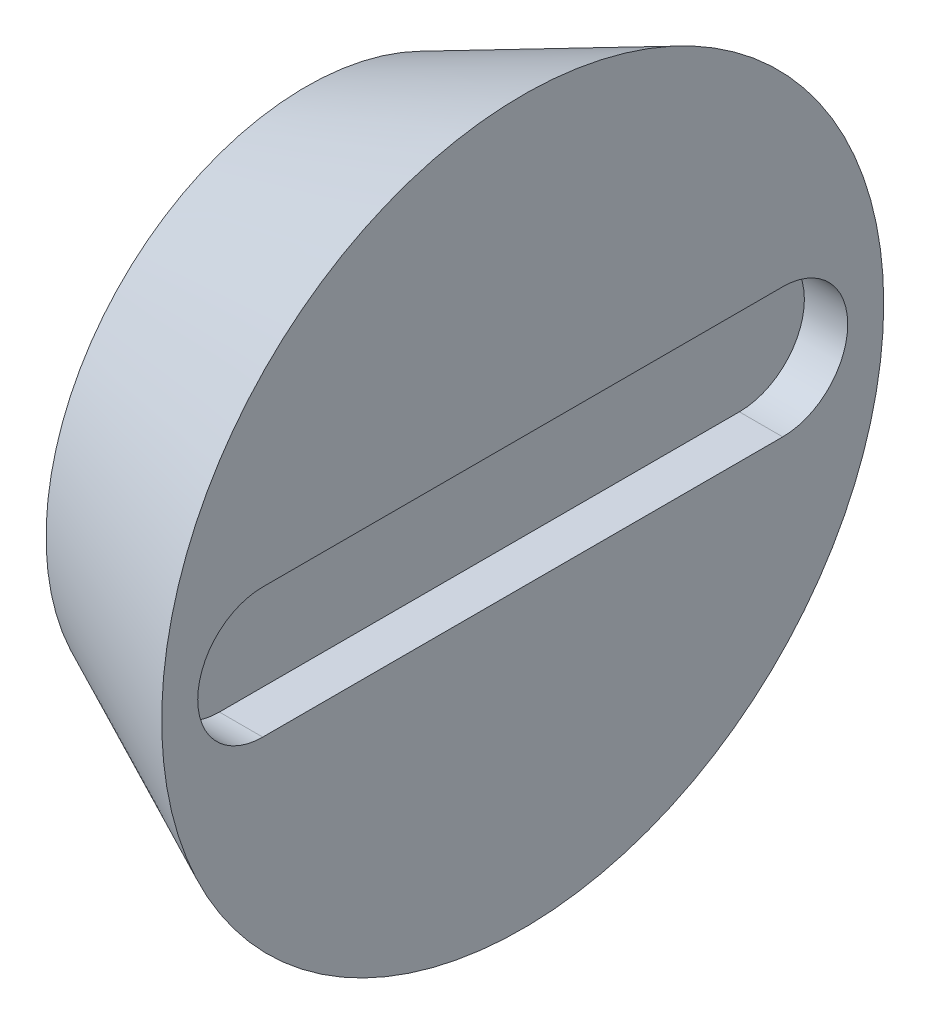
ISO-10303-21;
HEADER;
FILE_DESCRIPTION(('STEP AP214'),'2;1');
FILE_NAME('part.step','',(''),(''),'','','');
FILE_SCHEMA(('AUTOMOTIVE_DESIGN { 1 0 10303 214 1 1 1 1 }'));
ENDSEC;
DATA;
#1=APPLICATION_CONTEXT('core data for automotive mechanical design processes');
#2=APPLICATION_PROTOCOL_DEFINITION('international standard','automotive_design',2000,#1);
#3=PRODUCT_CONTEXT('',#1,'mechanical');
#4=PRODUCT('Part','Part','',(#3));
#5=PRODUCT_RELATED_PRODUCT_CATEGORY('part','',(#4));
#6=PRODUCT_DEFINITION_FORMATION('','',#4);
#7=PRODUCT_DEFINITION_CONTEXT('part definition',#1,'design');
#8=PRODUCT_DEFINITION('design','',#6,#7);
#9=PRODUCT_DEFINITION_SHAPE('','',#8);
#10=(LENGTH_UNIT() NAMED_UNIT(*) SI_UNIT(.MILLI.,.METRE.));
#11=(NAMED_UNIT(*) PLANE_ANGLE_UNIT() SI_UNIT($,.RADIAN.));
#12=(NAMED_UNIT(*) SI_UNIT($,.STERADIAN.) SOLID_ANGLE_UNIT());
#13=UNCERTAINTY_MEASURE_WITH_UNIT(LENGTH_MEASURE(1.E-05),#10,'distance_accuracy_value','');
#14=(GEOMETRIC_REPRESENTATION_CONTEXT(3) GLOBAL_UNCERTAINTY_ASSIGNED_CONTEXT((#13)) GLOBAL_UNIT_ASSIGNED_CONTEXT((#10,
#11,#12)) REPRESENTATION_CONTEXT('',''));
#15=CARTESIAN_POINT('',(0.,0.,0.));
#16=DIRECTION('',(0.,0.,1.));
#17=DIRECTION('',(1.,0.,0.));
#18=AXIS2_PLACEMENT_3D('',#15,#16,#17);
#19=CARTESIAN_POINT('',(0.,0.,0.));
#20=DIRECTION('',(1.,0.,0.));
#21=DIRECTION('',(0.,0.,-1.));
#22=AXIS2_PLACEMENT_3D('',#19,#20,#21);
#23=CONICAL_SURFACE('',#22,30.,0.436332312998583);
#24=CARTESIAN_POINT('',(25.,0.,0.));
#25=DIRECTION('',(1.,0.,0.));
#26=DIRECTION('',(0.,0.,-1.));
#27=AXIS2_PLACEMENT_3D('',#24,#25,#26);
#28=CIRCLE('',#27,41.657691453875);
#29=CARTESIAN_POINT('',(25.,0.,-41.657691453875));
#30=VERTEX_POINT('',#29);
#31=EDGE_CURVE('E11',#30,#30,#28,.T.);
#32=ORIENTED_EDGE('',*,*,#31,.F.);
#33=EDGE_LOOP('',(#32));
#34=FACE_BOUND('',#33,.T.);
#35=CARTESIAN_POINT('',(0.,0.,0.));
#36=DIRECTION('',(1.,0.,0.));
#37=DIRECTION('',(0.,0.,-1.));
#38=AXIS2_PLACEMENT_3D('',#35,#36,#37);
#39=CIRCLE('',#38,30.);
#40=CARTESIAN_POINT('',(0.,0.,-30.));
#41=VERTEX_POINT('',#40);
#42=EDGE_CURVE('E39',#41,#41,#39,.T.);
#43=ORIENTED_EDGE('',*,*,#42,.T.);
#44=EDGE_LOOP('',(#43));
#45=FACE_BOUND('',#44,.T.);
#46=ADVANCED_FACE('F32',(#34,#45),#23,.T.);
#47=CARTESIAN_POINT('',(25.,0.,0.));
#48=DIRECTION('',(1.,0.,0.));
#49=DIRECTION('',(0.,0.,-1.));
#50=AXIS2_PLACEMENT_3D('',#47,#48,#49);
#51=PLANE('',#50);
#52=CARTESIAN_POINT('',(25.,0.,30.));
#53=DIRECTION('',(1.,0.,0.));
#54=DIRECTION('',(0.,0.,-1.));
#55=AXIS2_PLACEMENT_3D('',#52,#53,#54);
#56=CIRCLE('',#55,7.5);
#57=CARTESIAN_POINT('',(25.,7.5,30.));
#58=VERTEX_POINT('',#57);
#59=CARTESIAN_POINT('',(25.,-7.5,30.));
#60=VERTEX_POINT('',#59);
#61=EDGE_CURVE('E46',#58,#60,#56,.T.);
#62=ORIENTED_EDGE('',*,*,#61,.F.);
#63=DIRECTION('',(0.,0.,1.));
#64=VECTOR('',#63,1.);
#65=CARTESIAN_POINT('',(25.,7.5,30.));
#66=LINE('',#65,#64);
#67=CARTESIAN_POINT('',(25.,7.5,-30.));
#68=VERTEX_POINT('',#67);
#69=EDGE_CURVE('E97',#68,#58,#66,.T.);
#70=ORIENTED_EDGE('',*,*,#69,.F.);
#71=CARTESIAN_POINT('',(25.,0.,-30.));
#72=DIRECTION('',(1.,0.,0.));
#73=DIRECTION('',(0.,0.,-1.));
#74=AXIS2_PLACEMENT_3D('',#71,#72,#73);
#75=CIRCLE('',#74,7.5);
#76=CARTESIAN_POINT('',(25.,-7.5,-30.));
#77=VERTEX_POINT('',#76);
#78=EDGE_CURVE('E103',#77,#68,#75,.T.);
#79=ORIENTED_EDGE('',*,*,#78,.F.);
#80=DIRECTION('',(0.,0.,-1.));
#81=VECTOR('',#80,1.);
#82=CARTESIAN_POINT('',(25.,-7.5,30.));
#83=LINE('',#82,#81);
#84=EDGE_CURVE('E81',#60,#77,#83,.T.);
#85=ORIENTED_EDGE('',*,*,#84,.F.);
#86=EDGE_LOOP('',(#62,#70,#79,#85));
#87=FACE_BOUND('',#86,.T.);
#88=ORIENTED_EDGE('',*,*,#31,.T.);
#89=EDGE_LOOP('',(#88));
#90=FACE_BOUND('',#89,.T.);
#91=ADVANCED_FACE('F115',(#87,#90),#51,.T.);
#92=CARTESIAN_POINT('',(0.,0.,0.));
#93=DIRECTION('',(1.,0.,0.));
#94=DIRECTION('',(0.,0.,-1.));
#95=AXIS2_PLACEMENT_3D('',#92,#93,#94);
#96=PLANE('',#95);
#97=ORIENTED_EDGE('',*,*,#42,.F.);
#98=EDGE_LOOP('',(#97));
#99=FACE_BOUND('',#98,.T.);
#100=ADVANCED_FACE('F112',(#99),#96,.F.);
#101=CARTESIAN_POINT('',(20.,0.,30.));
#102=DIRECTION('',(1.,0.,0.));
#103=DIRECTION('',(0.,0.,-1.));
#104=AXIS2_PLACEMENT_3D('',#101,#102,#103);
#105=CYLINDRICAL_SURFACE('',#104,7.5);
#106=ORIENTED_EDGE('',*,*,#61,.T.);
#107=DIRECTION('',(1.,0.,0.));
#108=VECTOR('',#107,1.);
#109=CARTESIAN_POINT('',(20.,-7.5,30.));
#110=LINE('',#109,#108);
#111=CARTESIAN_POINT('',(20.,-7.5,30.));
#112=VERTEX_POINT('',#111);
#113=EDGE_CURVE('E69',#112,#60,#110,.T.);
#114=ORIENTED_EDGE('',*,*,#113,.F.);
#115=CARTESIAN_POINT('',(20.,0.,30.));
#116=DIRECTION('',(1.,0.,0.));
#117=DIRECTION('',(0.,0.,-1.));
#118=AXIS2_PLACEMENT_3D('',#115,#116,#117);
#119=CIRCLE('',#118,7.5);
#120=CARTESIAN_POINT('',(20.,7.5,30.));
#121=VERTEX_POINT('',#120);
#122=EDGE_CURVE('E95',#121,#112,#119,.T.);
#123=ORIENTED_EDGE('',*,*,#122,.F.);
#124=DIRECTION('',(1.,0.,0.));
#125=VECTOR('',#124,1.);
#126=CARTESIAN_POINT('',(20.,7.5,30.));
#127=LINE('',#126,#125);
#128=EDGE_CURVE('E54',#121,#58,#127,.T.);
#129=ORIENTED_EDGE('',*,*,#128,.T.);
#130=EDGE_LOOP('',(#106,#114,#123,#129));
#131=FACE_BOUND('',#130,.T.);
#132=ADVANCED_FACE('F114',(#131),#105,.F.);
#133=CARTESIAN_POINT('',(20.,7.5,30.));
#134=DIRECTION('',(0.,1.,0.));
#135=DIRECTION('',(0.,0.,1.));
#136=AXIS2_PLACEMENT_3D('',#133,#134,#135);
#137=PLANE('',#136);
#138=ORIENTED_EDGE('',*,*,#69,.T.);
#139=ORIENTED_EDGE('',*,*,#128,.F.);
#140=DIRECTION('',(0.,0.,1.));
#141=VECTOR('',#140,1.);
#142=CARTESIAN_POINT('',(20.,7.5,30.));
#143=LINE('',#142,#141);
#144=CARTESIAN_POINT('',(20.,7.5,-30.));
#145=VERTEX_POINT('',#144);
#146=EDGE_CURVE('E92',#145,#121,#143,.T.);
#147=ORIENTED_EDGE('',*,*,#146,.F.);
#148=DIRECTION('',(1.,0.,0.));
#149=VECTOR('',#148,1.);
#150=CARTESIAN_POINT('',(20.,7.5,-30.));
#151=LINE('',#150,#149);
#152=EDGE_CURVE('E85',#145,#68,#151,.T.);
#153=ORIENTED_EDGE('',*,*,#152,.T.);
#154=EDGE_LOOP('',(#138,#139,#147,#153));
#155=FACE_BOUND('',#154,.T.);
#156=ADVANCED_FACE('F120',(#155),#137,.F.);
#157=CARTESIAN_POINT('',(20.,0.,-30.));
#158=DIRECTION('',(1.,0.,0.));
#159=DIRECTION('',(0.,0.,-1.));
#160=AXIS2_PLACEMENT_3D('',#157,#158,#159);
#161=CYLINDRICAL_SURFACE('',#160,7.5);
#162=ORIENTED_EDGE('',*,*,#78,.T.);
#163=ORIENTED_EDGE('',*,*,#152,.F.);
#164=CARTESIAN_POINT('',(20.,0.,-30.));
#165=DIRECTION('',(1.,0.,0.));
#166=DIRECTION('',(0.,0.,-1.));
#167=AXIS2_PLACEMENT_3D('',#164,#165,#166);
#168=CIRCLE('',#167,7.5);
#169=CARTESIAN_POINT('',(20.,-7.5,-30.));
#170=VERTEX_POINT('',#169);
#171=EDGE_CURVE('E88',#170,#145,#168,.T.);
#172=ORIENTED_EDGE('',*,*,#171,.F.);
#173=DIRECTION('',(1.,0.,0.));
#174=VECTOR('',#173,1.);
#175=CARTESIAN_POINT('',(20.,-7.5,-30.));
#176=LINE('',#175,#174);
#177=EDGE_CURVE('E74',#170,#77,#176,.T.);
#178=ORIENTED_EDGE('',*,*,#177,.T.);
#179=EDGE_LOOP('',(#162,#163,#172,#178));
#180=FACE_BOUND('',#179,.T.);
#181=ADVANCED_FACE('F89',(#180),#161,.F.);
#182=CARTESIAN_POINT('',(20.,-7.5,30.));
#183=DIRECTION('',(0.,-1.,0.));
#184=DIRECTION('',(0.,0.,-1.));
#185=AXIS2_PLACEMENT_3D('',#182,#183,#184);
#186=PLANE('',#185);
#187=ORIENTED_EDGE('',*,*,#84,.T.);
#188=ORIENTED_EDGE('',*,*,#177,.F.);
#189=DIRECTION('',(0.,0.,-1.));
#190=VECTOR('',#189,1.);
#191=CARTESIAN_POINT('',(20.,-7.5,30.));
#192=LINE('',#191,#190);
#193=EDGE_CURVE('E78',#112,#170,#192,.T.);
#194=ORIENTED_EDGE('',*,*,#193,.F.);
#195=ORIENTED_EDGE('',*,*,#113,.T.);
#196=EDGE_LOOP('',(#187,#188,#194,#195));
#197=FACE_BOUND('',#196,.T.);
#198=ADVANCED_FACE('F76',(#197),#186,.F.);
#199=CARTESIAN_POINT('',(20.,0.,30.));
#200=DIRECTION('',(1.,0.,0.));
#201=DIRECTION('',(0.,0.,-1.));
#202=AXIS2_PLACEMENT_3D('',#199,#200,#201);
#203=PLANE('',#202);
#204=ORIENTED_EDGE('',*,*,#122,.T.);
#205=ORIENTED_EDGE('',*,*,#193,.T.);
#206=ORIENTED_EDGE('',*,*,#171,.T.);
#207=ORIENTED_EDGE('',*,*,#146,.T.);
#208=EDGE_LOOP('',(#204,#205,#206,#207));
#209=FACE_BOUND('',#208,.T.);
#210=ADVANCED_FACE('F94',(#209),#203,.T.);
#211=CLOSED_SHELL('',(#46,#91,#100,#132,#156,#181,#198,#210));
#212=MANIFOLD_SOLID_BREP('B2',#211);
#213=ADVANCED_BREP_SHAPE_REPRESENTATION('',(#18,#212),#14);
#214=SHAPE_DEFINITION_REPRESENTATION(#9,#213);
ENDSEC;
END-ISO-10303-21;
